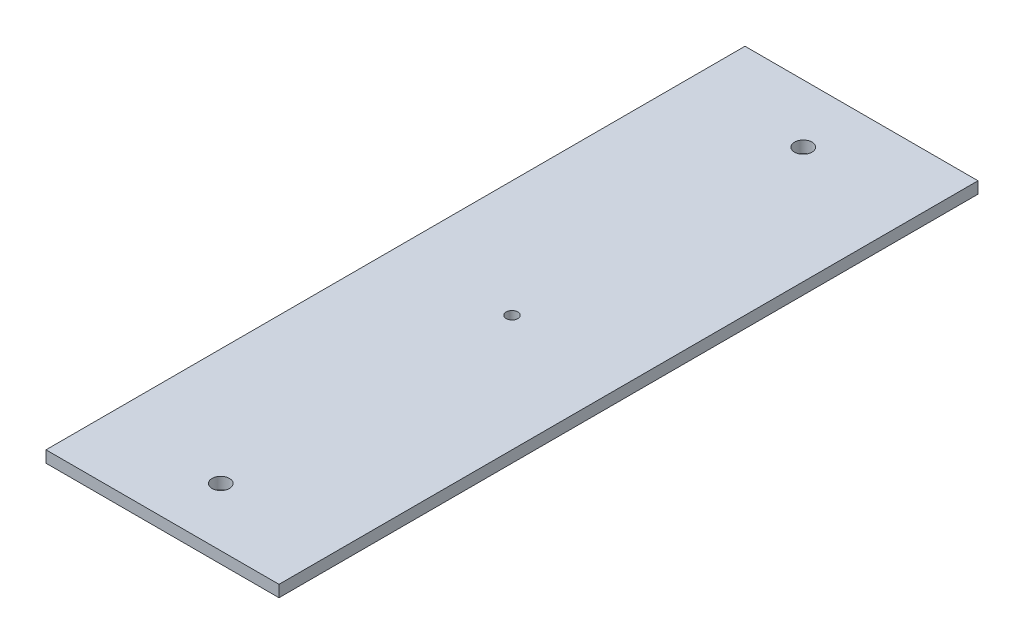
ISO-10303-21;
HEADER;
FILE_DESCRIPTION(('STEP AP214'),'2;1');
FILE_NAME('part.step','',(''),(''),'','','');
FILE_SCHEMA(('AUTOMOTIVE_DESIGN { 1 0 10303 214 1 1 1 1 }'));
ENDSEC;
DATA;
#1=APPLICATION_CONTEXT('core data for automotive mechanical design processes');
#2=APPLICATION_PROTOCOL_DEFINITION('international standard','automotive_design',2000,#1);
#3=PRODUCT_CONTEXT('',#1,'mechanical');
#4=PRODUCT('Part','Part','',(#3));
#5=PRODUCT_RELATED_PRODUCT_CATEGORY('part','',(#4));
#6=PRODUCT_DEFINITION_FORMATION('','',#4);
#7=PRODUCT_DEFINITION_CONTEXT('part definition',#1,'design');
#8=PRODUCT_DEFINITION('design','',#6,#7);
#9=PRODUCT_DEFINITION_SHAPE('','',#8);
#10=(LENGTH_UNIT() NAMED_UNIT(*) SI_UNIT(.MILLI.,.METRE.));
#11=(NAMED_UNIT(*) PLANE_ANGLE_UNIT() SI_UNIT($,.RADIAN.));
#12=(NAMED_UNIT(*) SI_UNIT($,.STERADIAN.) SOLID_ANGLE_UNIT());
#13=UNCERTAINTY_MEASURE_WITH_UNIT(LENGTH_MEASURE(1.E-05),#10,'distance_accuracy_value','');
#14=(GEOMETRIC_REPRESENTATION_CONTEXT(3) GLOBAL_UNCERTAINTY_ASSIGNED_CONTEXT((#13)) GLOBAL_UNIT_ASSIGNED_CONTEXT((#10,
#11,#12)) REPRESENTATION_CONTEXT('',''));
#15=CARTESIAN_POINT('',(0.,0.,0.));
#16=DIRECTION('',(0.,0.,1.));
#17=DIRECTION('',(1.,0.,0.));
#18=AXIS2_PLACEMENT_3D('',#15,#16,#17);
#19=CARTESIAN_POINT('',(0.,2.,0.));
#20=DIRECTION('',(0.,-1.,0.));
#21=DIRECTION('',(0.,0.,-1.));
#22=AXIS2_PLACEMENT_3D('',#19,#20,#21);
#23=PLANE('',#22);
#24=DIRECTION('',(0.,0.,1.));
#25=VECTOR('',#24,1.);
#26=CARTESIAN_POINT('',(0.,2.,0.));
#27=LINE('',#26,#25);
#28=CARTESIAN_POINT('',(0.,2.,-120.));
#29=VERTEX_POINT('',#28);
#30=CARTESIAN_POINT('',(0.,2.,0.));
#31=VERTEX_POINT('',#30);
#32=EDGE_CURVE('E85',#29,#31,#27,.T.);
#33=ORIENTED_EDGE('',*,*,#32,.T.);
#34=DIRECTION('',(1.,0.,0.));
#35=VECTOR('',#34,1.);
#36=CARTESIAN_POINT('',(0.,2.,0.));
#37=LINE('',#36,#35);
#38=CARTESIAN_POINT('',(40.,2.,0.));
#39=VERTEX_POINT('',#38);
#40=EDGE_CURVE('E80',#31,#39,#37,.T.);
#41=ORIENTED_EDGE('',*,*,#40,.T.);
#42=DIRECTION('',(0.,0.,-1.));
#43=VECTOR('',#42,1.);
#44=CARTESIAN_POINT('',(40.,2.,0.));
#45=LINE('',#44,#43);
#46=CARTESIAN_POINT('',(40.,2.,-120.));
#47=VERTEX_POINT('',#46);
#48=EDGE_CURVE('E83',#39,#47,#45,.T.);
#49=ORIENTED_EDGE('',*,*,#48,.T.);
#50=DIRECTION('',(-1.,0.,0.));
#51=VECTOR('',#50,1.);
#52=CARTESIAN_POINT('',(0.,2.,-120.));
#53=LINE('',#52,#51);
#54=EDGE_CURVE('E50',#47,#29,#53,.T.);
#55=ORIENTED_EDGE('',*,*,#54,.T.);
#56=EDGE_LOOP('',(#33,#41,#49,#55));
#57=FACE_BOUND('',#56,.T.);
#58=CARTESIAN_POINT('',(20.,2.,-10.));
#59=DIRECTION('',(0.,1.,0.));
#60=DIRECTION('',(0.,0.,1.));
#61=AXIS2_PLACEMENT_3D('',#58,#59,#60);
#62=CIRCLE('',#61,1.5);
#63=CARTESIAN_POINT('',(20.,2.,-8.5));
#64=VERTEX_POINT('',#63);
#65=EDGE_CURVE('E100',#64,#64,#62,.T.);
#66=ORIENTED_EDGE('',*,*,#65,.F.);
#67=EDGE_LOOP('',(#66));
#68=FACE_BOUND('',#67,.T.);
#69=CARTESIAN_POINT('',(20.,2.,-110.));
#70=DIRECTION('',(0.,1.,0.));
#71=DIRECTION('',(0.,0.,1.));
#72=AXIS2_PLACEMENT_3D('',#69,#70,#71);
#73=CIRCLE('',#72,1.5);
#74=CARTESIAN_POINT('',(20.,2.,-108.5));
#75=VERTEX_POINT('',#74);
#76=EDGE_CURVE('E115',#75,#75,#73,.T.);
#77=ORIENTED_EDGE('',*,*,#76,.F.);
#78=EDGE_LOOP('',(#77));
#79=FACE_BOUND('',#78,.T.);
#80=CARTESIAN_POINT('',(20.,2.,-60.));
#81=DIRECTION('',(0.,1.,0.));
#82=DIRECTION('',(0.,0.,1.));
#83=AXIS2_PLACEMENT_3D('',#80,#81,#82);
#84=CIRCLE('',#83,1.);
#85=CARTESIAN_POINT('',(20.,2.,-59.));
#86=VERTEX_POINT('',#85);
#87=EDGE_CURVE('E121',#86,#86,#84,.T.);
#88=ORIENTED_EDGE('',*,*,#87,.F.);
#89=EDGE_LOOP('',(#88));
#90=FACE_BOUND('',#89,.T.);
#91=ADVANCED_FACE('F33',(#57,#68,#79,#90),#23,.F.);
#92=CARTESIAN_POINT('',(0.,0.,0.));
#93=DIRECTION('',(0.,-1.,0.));
#94=DIRECTION('',(0.,0.,-1.));
#95=AXIS2_PLACEMENT_3D('',#92,#93,#94);
#96=PLANE('',#95);
#97=CARTESIAN_POINT('',(20.,0.,-110.));
#98=DIRECTION('',(0.,1.,0.));
#99=DIRECTION('',(0.,0.,1.));
#100=AXIS2_PLACEMENT_3D('',#97,#98,#99);
#101=CIRCLE('',#100,1.5);
#102=CARTESIAN_POINT('',(20.,0.,-108.5));
#103=VERTEX_POINT('',#102);
#104=EDGE_CURVE('E118',#103,#103,#101,.T.);
#105=ORIENTED_EDGE('',*,*,#104,.T.);
#106=EDGE_LOOP('',(#105));
#107=FACE_BOUND('',#106,.T.);
#108=DIRECTION('',(0.,0.,1.));
#109=VECTOR('',#108,1.);
#110=CARTESIAN_POINT('',(0.,0.,0.));
#111=LINE('',#110,#109);
#112=CARTESIAN_POINT('',(0.,0.,-120.));
#113=VERTEX_POINT('',#112);
#114=CARTESIAN_POINT('',(0.,0.,0.));
#115=VERTEX_POINT('',#114);
#116=EDGE_CURVE('E97',#113,#115,#111,.T.);
#117=ORIENTED_EDGE('',*,*,#116,.F.);
#118=DIRECTION('',(-1.,0.,0.));
#119=VECTOR('',#118,1.);
#120=CARTESIAN_POINT('',(0.,0.,-120.));
#121=LINE('',#120,#119);
#122=CARTESIAN_POINT('',(40.,0.,-120.));
#123=VERTEX_POINT('',#122);
#124=EDGE_CURVE('E73',#123,#113,#121,.T.);
#125=ORIENTED_EDGE('',*,*,#124,.F.);
#126=DIRECTION('',(0.,0.,-1.));
#127=VECTOR('',#126,1.);
#128=CARTESIAN_POINT('',(40.,0.,0.));
#129=LINE('',#128,#127);
#130=CARTESIAN_POINT('',(40.,0.,0.));
#131=VERTEX_POINT('',#130);
#132=EDGE_CURVE('E67',#131,#123,#129,.T.);
#133=ORIENTED_EDGE('',*,*,#132,.F.);
#134=DIRECTION('',(1.,0.,0.));
#135=VECTOR('',#134,1.);
#136=CARTESIAN_POINT('',(0.,0.,0.));
#137=LINE('',#136,#135);
#138=EDGE_CURVE('E89',#115,#131,#137,.T.);
#139=ORIENTED_EDGE('',*,*,#138,.F.);
#140=EDGE_LOOP('',(#117,#125,#133,#139));
#141=FACE_BOUND('',#140,.T.);
#142=CARTESIAN_POINT('',(20.,0.,-10.));
#143=DIRECTION('',(0.,1.,0.));
#144=DIRECTION('',(0.,0.,1.));
#145=AXIS2_PLACEMENT_3D('',#142,#143,#144);
#146=CIRCLE('',#145,1.5);
#147=CARTESIAN_POINT('',(20.,0.,-8.5));
#148=VERTEX_POINT('',#147);
#149=EDGE_CURVE('E112',#148,#148,#146,.T.);
#150=ORIENTED_EDGE('',*,*,#149,.T.);
#151=EDGE_LOOP('',(#150));
#152=FACE_BOUND('',#151,.T.);
#153=CARTESIAN_POINT('',(20.,0.,-60.));
#154=DIRECTION('',(0.,1.,0.));
#155=DIRECTION('',(0.,0.,1.));
#156=AXIS2_PLACEMENT_3D('',#153,#154,#155);
#157=CIRCLE('',#156,1.);
#158=CARTESIAN_POINT('',(20.,0.,-59.));
#159=VERTEX_POINT('',#158);
#160=EDGE_CURVE('E124',#159,#159,#157,.T.);
#161=ORIENTED_EDGE('',*,*,#160,.T.);
#162=EDGE_LOOP('',(#161));
#163=FACE_BOUND('',#162,.T.);
#164=ADVANCED_FACE('F108',(#107,#141,#152,#163),#96,.T.);
#165=CARTESIAN_POINT('',(0.,2.,0.));
#166=DIRECTION('',(1.,0.,0.));
#167=DIRECTION('',(0.,0.,-1.));
#168=AXIS2_PLACEMENT_3D('',#165,#166,#167);
#169=PLANE('',#168);
#170=ORIENTED_EDGE('',*,*,#116,.T.);
#171=DIRECTION('',(0.,-1.,0.));
#172=VECTOR('',#171,1.);
#173=CARTESIAN_POINT('',(0.,2.,0.));
#174=LINE('',#173,#172);
#175=EDGE_CURVE('E11',#31,#115,#174,.T.);
#176=ORIENTED_EDGE('',*,*,#175,.F.);
#177=ORIENTED_EDGE('',*,*,#32,.F.);
#178=DIRECTION('',(0.,-1.,0.));
#179=VECTOR('',#178,1.);
#180=CARTESIAN_POINT('',(0.,2.,-120.));
#181=LINE('',#180,#179);
#182=EDGE_CURVE('E93',#29,#113,#181,.T.);
#183=ORIENTED_EDGE('',*,*,#182,.T.);
#184=EDGE_LOOP('',(#170,#176,#177,#183));
#185=FACE_BOUND('',#184,.T.);
#186=ADVANCED_FACE('F35',(#185),#169,.F.);
#187=CARTESIAN_POINT('',(0.,2.,0.));
#188=DIRECTION('',(0.,0.,-1.));
#189=DIRECTION('',(-1.,0.,0.));
#190=AXIS2_PLACEMENT_3D('',#187,#188,#189);
#191=PLANE('',#190);
#192=ORIENTED_EDGE('',*,*,#138,.T.);
#193=DIRECTION('',(0.,-1.,0.));
#194=VECTOR('',#193,1.);
#195=CARTESIAN_POINT('',(40.,2.,0.));
#196=LINE('',#195,#194);
#197=EDGE_CURVE('E42',#39,#131,#196,.T.);
#198=ORIENTED_EDGE('',*,*,#197,.F.);
#199=ORIENTED_EDGE('',*,*,#40,.F.);
#200=ORIENTED_EDGE('',*,*,#175,.T.);
#201=EDGE_LOOP('',(#192,#198,#199,#200));
#202=FACE_BOUND('',#201,.T.);
#203=ADVANCED_FACE('F88',(#202),#191,.F.);
#204=CARTESIAN_POINT('',(40.,2.,0.));
#205=DIRECTION('',(-1.,0.,0.));
#206=DIRECTION('',(0.,0.,1.));
#207=AXIS2_PLACEMENT_3D('',#204,#205,#206);
#208=PLANE('',#207);
#209=ORIENTED_EDGE('',*,*,#132,.T.);
#210=DIRECTION('',(0.,-1.,0.));
#211=VECTOR('',#210,1.);
#212=CARTESIAN_POINT('',(40.,2.,-120.));
#213=LINE('',#212,#211);
#214=EDGE_CURVE('E90',#47,#123,#213,.T.);
#215=ORIENTED_EDGE('',*,*,#214,.F.);
#216=ORIENTED_EDGE('',*,*,#48,.F.);
#217=ORIENTED_EDGE('',*,*,#197,.T.);
#218=EDGE_LOOP('',(#209,#215,#216,#217));
#219=FACE_BOUND('',#218,.T.);
#220=ADVANCED_FACE('F91',(#219),#208,.F.);
#221=CARTESIAN_POINT('',(0.,2.,-120.));
#222=DIRECTION('',(0.,0.,1.));
#223=DIRECTION('',(1.,0.,0.));
#224=AXIS2_PLACEMENT_3D('',#221,#222,#223);
#225=PLANE('',#224);
#226=ORIENTED_EDGE('',*,*,#124,.T.);
#227=ORIENTED_EDGE('',*,*,#182,.F.);
#228=ORIENTED_EDGE('',*,*,#54,.F.);
#229=ORIENTED_EDGE('',*,*,#214,.T.);
#230=EDGE_LOOP('',(#226,#227,#228,#229));
#231=FACE_BOUND('',#230,.T.);
#232=ADVANCED_FACE('F105',(#231),#225,.F.);
#233=CARTESIAN_POINT('',(20.,2.,-10.));
#234=DIRECTION('',(0.,-1.,0.));
#235=DIRECTION('',(0.,0.,-1.));
#236=AXIS2_PLACEMENT_3D('',#233,#234,#235);
#237=CYLINDRICAL_SURFACE('',#236,1.5);
#238=ORIENTED_EDGE('',*,*,#65,.T.);
#239=EDGE_LOOP('',(#238));
#240=FACE_BOUND('',#239,.T.);
#241=ORIENTED_EDGE('',*,*,#149,.F.);
#242=EDGE_LOOP('',(#241));
#243=FACE_BOUND('',#242,.T.);
#244=ADVANCED_FACE('F141',(#240,#243),#237,.F.);
#245=CARTESIAN_POINT('',(20.,2.,-110.));
#246=DIRECTION('',(0.,-1.,0.));
#247=DIRECTION('',(0.,0.,-1.));
#248=AXIS2_PLACEMENT_3D('',#245,#246,#247);
#249=CYLINDRICAL_SURFACE('',#248,1.5);
#250=ORIENTED_EDGE('',*,*,#76,.T.);
#251=EDGE_LOOP('',(#250));
#252=FACE_BOUND('',#251,.T.);
#253=ORIENTED_EDGE('',*,*,#104,.F.);
#254=EDGE_LOOP('',(#253));
#255=FACE_BOUND('',#254,.T.);
#256=ADVANCED_FACE('F187',(#252,#255),#249,.F.);
#257=CARTESIAN_POINT('',(20.,2.,-60.));
#258=DIRECTION('',(0.,-1.,0.));
#259=DIRECTION('',(0.,0.,-1.));
#260=AXIS2_PLACEMENT_3D('',#257,#258,#259);
#261=CYLINDRICAL_SURFACE('',#260,1.);
#262=ORIENTED_EDGE('',*,*,#87,.T.);
#263=EDGE_LOOP('',(#262));
#264=FACE_BOUND('',#263,.T.);
#265=ORIENTED_EDGE('',*,*,#160,.F.);
#266=EDGE_LOOP('',(#265));
#267=FACE_BOUND('',#266,.T.);
#268=ADVANCED_FACE('F130',(#264,#267),#261,.F.);
#269=CLOSED_SHELL('',(#91,#164,#186,#203,#220,#232,#244,#256,#268));
#270=MANIFOLD_SOLID_BREP('B2',#269);
#271=ADVANCED_BREP_SHAPE_REPRESENTATION('',(#18,#270),#14);
#272=SHAPE_DEFINITION_REPRESENTATION(#9,#271);
ENDSEC;
END-ISO-10303-21;
